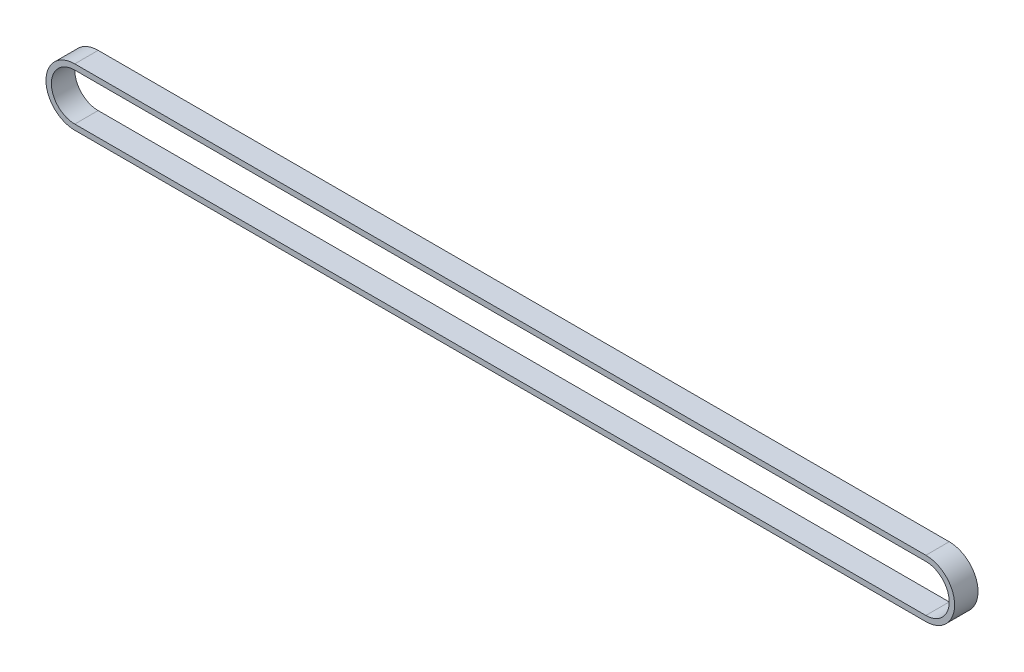
ISO-10303-21;
HEADER;
FILE_DESCRIPTION(('STEP AP214'),'2;1');
FILE_NAME('part.step','',(''),(''),'','','');
FILE_SCHEMA(('AUTOMOTIVE_DESIGN { 1 0 10303 214 1 1 1 1 }'));
ENDSEC;
DATA;
#1=APPLICATION_CONTEXT('core data for automotive mechanical design processes');
#2=APPLICATION_PROTOCOL_DEFINITION('international standard','automotive_design',2000,#1);
#3=PRODUCT_CONTEXT('',#1,'mechanical');
#4=PRODUCT('Part','Part','',(#3));
#5=PRODUCT_RELATED_PRODUCT_CATEGORY('part','',(#4));
#6=PRODUCT_DEFINITION_FORMATION('','',#4);
#7=PRODUCT_DEFINITION_CONTEXT('part definition',#1,'design');
#8=PRODUCT_DEFINITION('design','',#6,#7);
#9=PRODUCT_DEFINITION_SHAPE('','',#8);
#10=(LENGTH_UNIT() NAMED_UNIT(*) SI_UNIT(.MILLI.,.METRE.));
#11=(NAMED_UNIT(*) PLANE_ANGLE_UNIT() SI_UNIT($,.RADIAN.));
#12=(NAMED_UNIT(*) SI_UNIT($,.STERADIAN.) SOLID_ANGLE_UNIT());
#13=UNCERTAINTY_MEASURE_WITH_UNIT(LENGTH_MEASURE(1.E-05),#10,'distance_accuracy_value','');
#14=(GEOMETRIC_REPRESENTATION_CONTEXT(3) GLOBAL_UNCERTAINTY_ASSIGNED_CONTEXT((#13)) GLOBAL_UNIT_ASSIGNED_CONTEXT((#10,
#11,#12)) REPRESENTATION_CONTEXT('',''));
#15=CARTESIAN_POINT('',(0.,0.,0.));
#16=DIRECTION('',(0.,0.,1.));
#17=DIRECTION('',(1.,0.,0.));
#18=AXIS2_PLACEMENT_3D('',#15,#16,#17);
#19=CARTESIAN_POINT('',(-116.589562514286,-9.93249999999994,-2.99999999999997));
#20=DIRECTION('',(0.,0.,1.));
#21=DIRECTION('',(1.,0.,0.));
#22=AXIS2_PLACEMENT_3D('',#19,#20,#21);
#23=CYLINDRICAL_SURFACE('',#22,6.00000000000002);
#24=CARTESIAN_POINT('',(-116.589562514286,-9.93249999999994,2.99999999999997));
#25=DIRECTION('',(0.,0.,1.));
#26=DIRECTION('',(1.,0.,0.));
#27=AXIS2_PLACEMENT_3D('',#24,#25,#26);
#28=CIRCLE('',#27,6.00000000000002);
#29=CARTESIAN_POINT('',(-116.589562514286,-15.9324999999999,2.99999999999997));
#30=VERTEX_POINT('',#29);
#31=CARTESIAN_POINT('',(-116.589562514286,-3.93249999999993,2.99999999999997));
#32=VERTEX_POINT('',#31);
#33=EDGE_CURVE('E144',#30,#32,#28,.T.);
#34=ORIENTED_EDGE('',*,*,#33,.T.);
#35=DIRECTION('',(0.,0.,1.));
#36=VECTOR('',#35,1.);
#37=CARTESIAN_POINT('',(-116.589562514286,-3.93249999999993,-2.99999999999997));
#38=LINE('',#37,#36);
#39=CARTESIAN_POINT('',(-116.589562514286,-3.93249999999993,-2.99999999999997));
#40=VERTEX_POINT('',#39);
#41=EDGE_CURVE('E11',#40,#32,#38,.T.);
#42=ORIENTED_EDGE('',*,*,#41,.F.);
#43=CARTESIAN_POINT('',(-116.589562514286,-9.93249999999994,-2.99999999999997));
#44=DIRECTION('',(0.,0.,1.));
#45=DIRECTION('',(1.,0.,0.));
#46=AXIS2_PLACEMENT_3D('',#43,#44,#45);
#47=CIRCLE('',#46,6.00000000000002);
#48=CARTESIAN_POINT('',(-116.589562514286,-15.9324999999999,-2.99999999999997));
#49=VERTEX_POINT('',#48);
#50=EDGE_CURVE('E125',#49,#40,#47,.T.);
#51=ORIENTED_EDGE('',*,*,#50,.F.);
#52=DIRECTION('',(0.,0.,1.));
#53=VECTOR('',#52,1.);
#54=CARTESIAN_POINT('',(-116.589562514286,-15.9324999999999,-2.99999999999997));
#55=LINE('',#54,#53);
#56=EDGE_CURVE('E121',#49,#30,#55,.T.);
#57=ORIENTED_EDGE('',*,*,#56,.T.);
#58=EDGE_LOOP('',(#34,#42,#51,#57));
#59=FACE_BOUND('',#58,.T.);
#60=ADVANCED_FACE('F35',(#59),#23,.F.);
#61=CARTESIAN_POINT('',(0.,-3.93249999999992,-2.99999999999997));
#62=DIRECTION('',(0.,1.,0.));
#63=DIRECTION('',(-1.,0.,0.));
#64=AXIS2_PLACEMENT_3D('',#61,#62,#63);
#65=PLANE('',#64);
#66=DIRECTION('',(-1.,0.,0.));
#67=VECTOR('',#66,1.);
#68=CARTESIAN_POINT('',(0.,-3.93249999999992,2.99999999999997));
#69=LINE('',#68,#67);
#70=CARTESIAN_POINT('',(-334.990437485714,-3.93249999999996,2.99999999999997));
#71=VERTEX_POINT('',#70);
#72=EDGE_CURVE('E79',#32,#71,#69,.T.);
#73=ORIENTED_EDGE('',*,*,#72,.T.);
#74=DIRECTION('',(0.,0.,1.));
#75=VECTOR('',#74,1.);
#76=CARTESIAN_POINT('',(-334.990437485714,-3.93249999999996,-2.99999999999997));
#77=LINE('',#76,#75);
#78=CARTESIAN_POINT('',(-334.990437485714,-3.93249999999996,-2.99999999999997));
#79=VERTEX_POINT('',#78);
#80=EDGE_CURVE('E45',#79,#71,#77,.T.);
#81=ORIENTED_EDGE('',*,*,#80,.F.);
#82=DIRECTION('',(-1.,0.,0.));
#83=VECTOR('',#82,1.);
#84=CARTESIAN_POINT('',(0.,-3.93249999999992,-2.99999999999997));
#85=LINE('',#84,#83);
#86=EDGE_CURVE('E53',#40,#79,#85,.T.);
#87=ORIENTED_EDGE('',*,*,#86,.F.);
#88=ORIENTED_EDGE('',*,*,#41,.T.);
#89=EDGE_LOOP('',(#73,#81,#87,#88));
#90=FACE_BOUND('',#89,.T.);
#91=ADVANCED_FACE('F178',(#90),#65,.F.);
#92=CARTESIAN_POINT('',(-334.990437485714,-9.93249999999994,-2.99999999999997));
#93=DIRECTION('',(0.,0.,1.));
#94=DIRECTION('',(1.,0.,0.));
#95=AXIS2_PLACEMENT_3D('',#92,#93,#94);
#96=CYLINDRICAL_SURFACE('',#95,5.99999999999999);
#97=CARTESIAN_POINT('',(-334.990437485714,-9.93249999999994,2.99999999999997));
#98=DIRECTION('',(0.,0.,1.));
#99=DIRECTION('',(1.,0.,0.));
#100=AXIS2_PLACEMENT_3D('',#97,#98,#99);
#101=CIRCLE('',#100,5.99999999999999);
#102=CARTESIAN_POINT('',(-334.990437485714,-15.9325,2.99999999999997));
#103=VERTEX_POINT('',#102);
#104=EDGE_CURVE('E117',#71,#103,#101,.T.);
#105=ORIENTED_EDGE('',*,*,#104,.T.);
#106=DIRECTION('',(0.,0.,1.));
#107=VECTOR('',#106,1.);
#108=CARTESIAN_POINT('',(-334.990437485714,-15.9325,-2.99999999999997));
#109=LINE('',#108,#107);
#110=CARTESIAN_POINT('',(-334.990437485714,-15.9325,-2.99999999999997));
#111=VERTEX_POINT('',#110);
#112=EDGE_CURVE('E115',#111,#103,#109,.T.);
#113=ORIENTED_EDGE('',*,*,#112,.F.);
#114=CARTESIAN_POINT('',(-334.990437485714,-9.93249999999994,-2.99999999999997));
#115=DIRECTION('',(0.,0.,1.));
#116=DIRECTION('',(1.,0.,0.));
#117=AXIS2_PLACEMENT_3D('',#114,#115,#116);
#118=CIRCLE('',#117,5.99999999999999);
#119=EDGE_CURVE('E107',#79,#111,#118,.T.);
#120=ORIENTED_EDGE('',*,*,#119,.F.);
#121=ORIENTED_EDGE('',*,*,#80,.T.);
#122=EDGE_LOOP('',(#105,#113,#120,#121));
#123=FACE_BOUND('',#122,.T.);
#124=ADVANCED_FACE('F116',(#123),#96,.F.);
#125=CARTESIAN_POINT('',(0.,-17.3124999999999,-2.99999999999997));
#126=DIRECTION('',(0.,1.,0.));
#127=DIRECTION('',(-1.,0.,0.));
#128=AXIS2_PLACEMENT_3D('',#125,#126,#127);
#129=PLANE('',#128);
#130=DIRECTION('',(-1.,0.,0.));
#131=VECTOR('',#130,1.);
#132=CARTESIAN_POINT('',(0.,-17.3124999999999,2.99999999999997));
#133=LINE('',#132,#131);
#134=CARTESIAN_POINT('',(-116.589562514286,-17.3124999999999,2.99999999999997));
#135=VERTEX_POINT('',#134);
#136=CARTESIAN_POINT('',(-334.990437485714,-17.3125,2.99999999999997));
#137=VERTEX_POINT('',#136);
#138=EDGE_CURVE('E132',#135,#137,#133,.T.);
#139=ORIENTED_EDGE('',*,*,#138,.T.);
#140=DIRECTION('',(0.,0.,1.));
#141=VECTOR('',#140,1.);
#142=CARTESIAN_POINT('',(-334.990437485714,-17.3125,-2.99999999999997));
#143=LINE('',#142,#141);
#144=CARTESIAN_POINT('',(-334.990437485714,-17.3125,-2.99999999999997));
#145=VERTEX_POINT('',#144);
#146=EDGE_CURVE('E154',#145,#137,#143,.T.);
#147=ORIENTED_EDGE('',*,*,#146,.F.);
#148=DIRECTION('',(-1.,0.,0.));
#149=VECTOR('',#148,1.);
#150=CARTESIAN_POINT('',(0.,-17.3124999999999,-2.99999999999997));
#151=LINE('',#150,#149);
#152=CARTESIAN_POINT('',(-116.589562514286,-17.3124999999999,-2.99999999999997));
#153=VERTEX_POINT('',#152);
#154=EDGE_CURVE('E150',#153,#145,#151,.T.);
#155=ORIENTED_EDGE('',*,*,#154,.F.);
#156=DIRECTION('',(0.,0.,1.));
#157=VECTOR('',#156,1.);
#158=CARTESIAN_POINT('',(-116.589562514286,-17.3124999999999,-2.99999999999997));
#159=LINE('',#158,#157);
#160=EDGE_CURVE('E39',#153,#135,#159,.T.);
#161=ORIENTED_EDGE('',*,*,#160,.T.);
#162=EDGE_LOOP('',(#139,#147,#155,#161));
#163=FACE_BOUND('',#162,.T.);
#164=ADVANCED_FACE('F37',(#163),#129,.F.);
#165=CARTESIAN_POINT('',(-334.990437485714,-9.93249999999994,-2.99999999999997));
#166=DIRECTION('',(0.,0.,1.));
#167=DIRECTION('',(1.,0.,0.));
#168=AXIS2_PLACEMENT_3D('',#165,#166,#167);
#169=CYLINDRICAL_SURFACE('',#168,7.38);
#170=CARTESIAN_POINT('',(-334.990437485714,-9.93249999999994,2.99999999999997));
#171=DIRECTION('',(0.,0.,1.));
#172=DIRECTION('',(1.,0.,0.));
#173=AXIS2_PLACEMENT_3D('',#170,#171,#172);
#174=CIRCLE('',#173,7.38);
#175=CARTESIAN_POINT('',(-334.990437485714,-2.55249999999995,2.99999999999997));
#176=VERTEX_POINT('',#175);
#177=EDGE_CURVE('E141',#176,#137,#174,.T.);
#178=ORIENTED_EDGE('',*,*,#177,.F.);
#179=DIRECTION('',(0.,0.,1.));
#180=VECTOR('',#179,1.);
#181=CARTESIAN_POINT('',(-334.990437485714,-2.55249999999995,-2.99999999999997));
#182=LINE('',#181,#180);
#183=CARTESIAN_POINT('',(-334.990437485714,-2.55249999999995,-2.99999999999997));
#184=VERTEX_POINT('',#183);
#185=EDGE_CURVE('E156',#184,#176,#182,.T.);
#186=ORIENTED_EDGE('',*,*,#185,.F.);
#187=CARTESIAN_POINT('',(-334.990437485714,-9.93249999999994,-2.99999999999997));
#188=DIRECTION('',(0.,0.,1.));
#189=DIRECTION('',(1.,0.,0.));
#190=AXIS2_PLACEMENT_3D('',#187,#188,#189);
#191=CIRCLE('',#190,7.38);
#192=EDGE_CURVE('E127',#184,#145,#191,.T.);
#193=ORIENTED_EDGE('',*,*,#192,.T.);
#194=ORIENTED_EDGE('',*,*,#146,.T.);
#195=EDGE_LOOP('',(#178,#186,#193,#194));
#196=FACE_BOUND('',#195,.T.);
#197=ADVANCED_FACE('F174',(#196),#169,.T.);
#198=CARTESIAN_POINT('',(0.,-2.55249999999991,-2.99999999999997));
#199=DIRECTION('',(0.,1.,0.));
#200=DIRECTION('',(-1.,0.,0.));
#201=AXIS2_PLACEMENT_3D('',#198,#199,#200);
#202=PLANE('',#201);
#203=DIRECTION('',(-1.,0.,0.));
#204=VECTOR('',#203,1.);
#205=CARTESIAN_POINT('',(0.,-2.55249999999991,2.99999999999997));
#206=LINE('',#205,#204);
#207=CARTESIAN_POINT('',(-116.589562514286,-2.55249999999994,2.99999999999997));
#208=VERTEX_POINT('',#207);
#209=EDGE_CURVE('E138',#208,#176,#206,.T.);
#210=ORIENTED_EDGE('',*,*,#209,.F.);
#211=DIRECTION('',(0.,0.,1.));
#212=VECTOR('',#211,1.);
#213=CARTESIAN_POINT('',(-116.589562514286,-2.55249999999994,-2.99999999999997));
#214=LINE('',#213,#212);
#215=CARTESIAN_POINT('',(-116.589562514286,-2.55249999999994,-2.99999999999997));
#216=VERTEX_POINT('',#215);
#217=EDGE_CURVE('E157',#216,#208,#214,.T.);
#218=ORIENTED_EDGE('',*,*,#217,.F.);
#219=DIRECTION('',(-1.,0.,0.));
#220=VECTOR('',#219,1.);
#221=CARTESIAN_POINT('',(0.,-2.55249999999991,-2.99999999999997));
#222=LINE('',#221,#220);
#223=EDGE_CURVE('E197',#216,#184,#222,.T.);
#224=ORIENTED_EDGE('',*,*,#223,.T.);
#225=ORIENTED_EDGE('',*,*,#185,.T.);
#226=EDGE_LOOP('',(#210,#218,#224,#225));
#227=FACE_BOUND('',#226,.T.);
#228=ADVANCED_FACE('F168',(#227),#202,.T.);
#229=CARTESIAN_POINT('',(-116.589562514286,-9.93249999999994,-2.99999999999997));
#230=DIRECTION('',(0.,0.,1.));
#231=DIRECTION('',(1.,0.,0.));
#232=AXIS2_PLACEMENT_3D('',#229,#230,#231);
#233=CYLINDRICAL_SURFACE('',#232,7.37999999999997);
#234=CARTESIAN_POINT('',(-116.589562514286,-9.93249999999994,2.99999999999997));
#235=DIRECTION('',(0.,0.,1.));
#236=DIRECTION('',(1.,0.,0.));
#237=AXIS2_PLACEMENT_3D('',#234,#235,#236);
#238=CIRCLE('',#237,7.37999999999997);
#239=EDGE_CURVE('E135',#135,#208,#238,.T.);
#240=ORIENTED_EDGE('',*,*,#239,.F.);
#241=ORIENTED_EDGE('',*,*,#160,.F.);
#242=CARTESIAN_POINT('',(-116.589562514286,-9.93249999999994,-2.99999999999997));
#243=DIRECTION('',(0.,0.,1.));
#244=DIRECTION('',(1.,0.,0.));
#245=AXIS2_PLACEMENT_3D('',#242,#243,#244);
#246=CIRCLE('',#245,7.37999999999997);
#247=EDGE_CURVE('E198',#153,#216,#246,.T.);
#248=ORIENTED_EDGE('',*,*,#247,.T.);
#249=ORIENTED_EDGE('',*,*,#217,.T.);
#250=EDGE_LOOP('',(#240,#241,#248,#249));
#251=FACE_BOUND('',#250,.T.);
#252=ADVANCED_FACE('F166',(#251),#233,.T.);
#253=CARTESIAN_POINT('',(0.,-15.9324999999999,-2.99999999999997));
#254=DIRECTION('',(0.,1.,0.));
#255=DIRECTION('',(-1.,0.,0.));
#256=AXIS2_PLACEMENT_3D('',#253,#254,#255);
#257=PLANE('',#256);
#258=DIRECTION('',(-1.,0.,0.));
#259=VECTOR('',#258,1.);
#260=CARTESIAN_POINT('',(0.,-15.9324999999999,2.99999999999997));
#261=LINE('',#260,#259);
#262=EDGE_CURVE('E147',#30,#103,#261,.T.);
#263=ORIENTED_EDGE('',*,*,#262,.F.);
#264=ORIENTED_EDGE('',*,*,#56,.F.);
#265=DIRECTION('',(-1.,0.,0.));
#266=VECTOR('',#265,1.);
#267=CARTESIAN_POINT('',(0.,-15.9324999999999,-2.99999999999997));
#268=LINE('',#267,#266);
#269=EDGE_CURVE('E111',#49,#111,#268,.T.);
#270=ORIENTED_EDGE('',*,*,#269,.T.);
#271=ORIENTED_EDGE('',*,*,#112,.T.);
#272=EDGE_LOOP('',(#263,#264,#270,#271));
#273=FACE_BOUND('',#272,.T.);
#274=ADVANCED_FACE('F123',(#273),#257,.T.);
#275=CARTESIAN_POINT('',(0.,0.,-2.99999999999997));
#276=DIRECTION('',(0.,0.,1.));
#277=DIRECTION('',(1.,0.,0.));
#278=AXIS2_PLACEMENT_3D('',#275,#276,#277);
#279=PLANE('',#278);
#280=ORIENTED_EDGE('',*,*,#154,.T.);
#281=ORIENTED_EDGE('',*,*,#192,.F.);
#282=ORIENTED_EDGE('',*,*,#223,.F.);
#283=ORIENTED_EDGE('',*,*,#247,.F.);
#284=EDGE_LOOP('',(#280,#281,#282,#283));
#285=FACE_BOUND('',#284,.T.);
#286=ORIENTED_EDGE('',*,*,#50,.T.);
#287=ORIENTED_EDGE('',*,*,#86,.T.);
#288=ORIENTED_EDGE('',*,*,#119,.T.);
#289=ORIENTED_EDGE('',*,*,#269,.F.);
#290=EDGE_LOOP('',(#286,#287,#288,#289));
#291=FACE_BOUND('',#290,.T.);
#292=ADVANCED_FACE('F109',(#285,#291),#279,.F.);
#293=CARTESIAN_POINT('',(0.,0.,2.99999999999997));
#294=DIRECTION('',(0.,0.,1.));
#295=DIRECTION('',(1.,0.,0.));
#296=AXIS2_PLACEMENT_3D('',#293,#294,#295);
#297=PLANE('',#296);
#298=ORIENTED_EDGE('',*,*,#138,.F.);
#299=ORIENTED_EDGE('',*,*,#239,.T.);
#300=ORIENTED_EDGE('',*,*,#209,.T.);
#301=ORIENTED_EDGE('',*,*,#177,.T.);
#302=EDGE_LOOP('',(#298,#299,#300,#301));
#303=FACE_BOUND('',#302,.T.);
#304=ORIENTED_EDGE('',*,*,#33,.F.);
#305=ORIENTED_EDGE('',*,*,#262,.T.);
#306=ORIENTED_EDGE('',*,*,#104,.F.);
#307=ORIENTED_EDGE('',*,*,#72,.F.);
#308=EDGE_LOOP('',(#304,#305,#306,#307));
#309=FACE_BOUND('',#308,.T.);
#310=ADVANCED_FACE('F164',(#303,#309),#297,.T.);
#311=CLOSED_SHELL('',(#60,#91,#124,#164,#197,#228,#252,#274,#292,#310));
#312=MANIFOLD_SOLID_BREP('B2',#311);
#313=ADVANCED_BREP_SHAPE_REPRESENTATION('',(#18,#312),#14);
#314=SHAPE_DEFINITION_REPRESENTATION(#9,#313);
ENDSEC;
END-ISO-10303-21;
